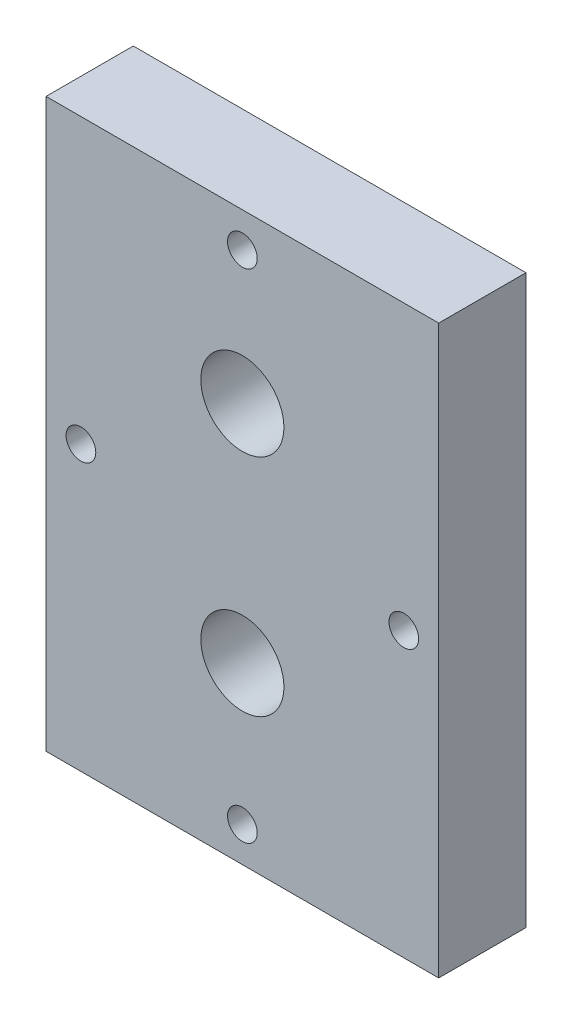
ISO-10303-21;
HEADER;
FILE_DESCRIPTION(('STEP AP214'),'2;1');
FILE_NAME('part.step','',(''),(''),'','','');
FILE_SCHEMA(('AUTOMOTIVE_DESIGN { 1 0 10303 214 1 1 1 1 }'));
ENDSEC;
DATA;
#1=APPLICATION_CONTEXT('core data for automotive mechanical design processes');
#2=APPLICATION_PROTOCOL_DEFINITION('international standard','automotive_design',2000,#1);
#3=PRODUCT_CONTEXT('',#1,'mechanical');
#4=PRODUCT('Part','Part','',(#3));
#5=PRODUCT_RELATED_PRODUCT_CATEGORY('part','',(#4));
#6=PRODUCT_DEFINITION_FORMATION('','',#4);
#7=PRODUCT_DEFINITION_CONTEXT('part definition',#1,'design');
#8=PRODUCT_DEFINITION('design','',#6,#7);
#9=PRODUCT_DEFINITION_SHAPE('','',#8);
#10=(LENGTH_UNIT() NAMED_UNIT(*) SI_UNIT(.MILLI.,.METRE.));
#11=(NAMED_UNIT(*) PLANE_ANGLE_UNIT() SI_UNIT($,.RADIAN.));
#12=(NAMED_UNIT(*) SI_UNIT($,.STERADIAN.) SOLID_ANGLE_UNIT());
#13=UNCERTAINTY_MEASURE_WITH_UNIT(LENGTH_MEASURE(1.E-05),#10,'distance_accuracy_value','');
#14=(GEOMETRIC_REPRESENTATION_CONTEXT(3) GLOBAL_UNCERTAINTY_ASSIGNED_CONTEXT((#13)) GLOBAL_UNIT_ASSIGNED_CONTEXT((#10,
#11,#12)) REPRESENTATION_CONTEXT('',''));
#15=CARTESIAN_POINT('',(0.,0.,0.));
#16=DIRECTION('',(0.,0.,1.));
#17=DIRECTION('',(1.,0.,0.));
#18=AXIS2_PLACEMENT_3D('',#15,#16,#17);
#19=CARTESIAN_POINT('',(-0.782851211177864,123.232367512817,-10.0000000000005));
#20=DIRECTION('',(0.,0.,-1.));
#21=DIRECTION('',(-1.,0.,0.));
#22=AXIS2_PLACEMENT_3D('',#19,#20,#21);
#23=CYLINDRICAL_SURFACE('',#22,1.69999999999999);
#24=CARTESIAN_POINT('',(-0.782851211177864,123.232367512817,0.));
#25=DIRECTION('',(0.,0.,1.));
#26=DIRECTION('',(1.,0.,0.));
#27=AXIS2_PLACEMENT_3D('',#24,#25,#26);
#28=CIRCLE('',#27,1.69999999999999);
#29=CARTESIAN_POINT('',(0.917148788822128,123.232367512817,0.));
#30=VERTEX_POINT('',#29);
#31=EDGE_CURVE('E159',#30,#30,#28,.T.);
#32=ORIENTED_EDGE('',*,*,#31,.T.);
#33=EDGE_LOOP('',(#32));
#34=FACE_BOUND('',#33,.T.);
#35=CARTESIAN_POINT('',(-0.782851211177864,123.232367512817,-7.55));
#36=DIRECTION('',(0.,0.,-1.));
#37=DIRECTION('',(-1.,0.,0.));
#38=AXIS2_PLACEMENT_3D('',#35,#36,#37);
#39=CIRCLE('',#38,1.69999999999999);
#40=CARTESIAN_POINT('',(-2.48285121117786,123.232367512817,-7.55));
#41=VERTEX_POINT('',#40);
#42=EDGE_CURVE('E34',#41,#41,#39,.F.);
#43=ORIENTED_EDGE('',*,*,#42,.F.);
#44=EDGE_LOOP('',(#43));
#45=FACE_BOUND('',#44,.T.);
#46=ADVANCED_FACE('F30',(#34,#45),#23,.F.);
#47=CARTESIAN_POINT('',(-41.7828512111779,90.7323675128174,-10.));
#48=DIRECTION('',(0.,0.,1.));
#49=DIRECTION('',(1.,0.,0.));
#50=AXIS2_PLACEMENT_3D('',#47,#48,#49);
#51=PLANE('',#50);
#52=CARTESIAN_POINT('',(-0.782851211177864,123.232367512817,-10.));
#53=DIRECTION('',(0.,0.,-1.));
#54=DIRECTION('',(-1.,0.,0.));
#55=AXIS2_PLACEMENT_3D('',#52,#53,#54);
#56=CIRCLE('',#55,3.75);
#57=CARTESIAN_POINT('',(-4.53285121117786,123.232367512817,-10.));
#58=VERTEX_POINT('',#57);
#59=EDGE_CURVE('E192',#58,#58,#56,.T.);
#60=ORIENTED_EDGE('',*,*,#59,.F.);
#61=EDGE_LOOP('',(#60));
#62=FACE_BOUND('',#61,.T.);
#63=CARTESIAN_POINT('',(-19.2828512111779,151.732367512817,-10.0000000000005));
#64=DIRECTION('',(0.,0.,-1.));
#65=DIRECTION('',(-1.,0.,0.));
#66=AXIS2_PLACEMENT_3D('',#63,#64,#65);
#67=CIRCLE('',#66,1.69999999999999);
#68=CARTESIAN_POINT('',(-20.9828512111778,151.732367512817,-10.0000000000005));
#69=VERTEX_POINT('',#68);
#70=EDGE_CURVE('E185',#69,#69,#67,.T.);
#71=ORIENTED_EDGE('',*,*,#70,.F.);
#72=EDGE_LOOP('',(#71));
#73=FACE_BOUND('',#72,.T.);
#74=CARTESIAN_POINT('',(-37.7828512111779,123.232367512817,-10.0000000000005));
#75=DIRECTION('',(0.,0.,-1.));
#76=DIRECTION('',(-1.,0.,0.));
#77=AXIS2_PLACEMENT_3D('',#74,#75,#76);
#78=CIRCLE('',#77,1.69999999999999);
#79=CARTESIAN_POINT('',(-39.4828512111779,123.232367512817,-10.0000000000005));
#80=VERTEX_POINT('',#79);
#81=EDGE_CURVE('E180',#80,#80,#78,.T.);
#82=ORIENTED_EDGE('',*,*,#81,.F.);
#83=EDGE_LOOP('',(#82));
#84=FACE_BOUND('',#83,.T.);
#85=CARTESIAN_POINT('',(-19.2828512111779,110.732367512817,-10.));
#86=DIRECTION('',(0.,0.,1.));
#87=DIRECTION('',(1.,0.,0.));
#88=AXIS2_PLACEMENT_3D('',#85,#86,#87);
#89=CIRCLE('',#88,4.7625);
#90=CARTESIAN_POINT('',(-14.5203512111779,110.732367512817,-10.));
#91=VERTEX_POINT('',#90);
#92=EDGE_CURVE('E172',#91,#91,#89,.T.);
#93=ORIENTED_EDGE('',*,*,#92,.T.);
#94=EDGE_LOOP('',(#93));
#95=FACE_BOUND('',#94,.T.);
#96=CARTESIAN_POINT('',(-19.2828512111779,136.502367512817,-10.));
#97=DIRECTION('',(0.,0.,1.));
#98=DIRECTION('',(1.,0.,0.));
#99=AXIS2_PLACEMENT_3D('',#96,#97,#98);
#100=CIRCLE('',#99,4.7625);
#101=CARTESIAN_POINT('',(-14.5203512111779,136.502367512817,-10.));
#102=VERTEX_POINT('',#101);
#103=EDGE_CURVE('E103',#102,#102,#100,.T.);
#104=ORIENTED_EDGE('',*,*,#103,.T.);
#105=EDGE_LOOP('',(#104));
#106=FACE_BOUND('',#105,.T.);
#107=DIRECTION('',(0.,-1.,0.));
#108=VECTOR('',#107,1.);
#109=CARTESIAN_POINT('',(-41.7828512111779,155.732367512817,-10.));
#110=LINE('',#109,#108);
#111=CARTESIAN_POINT('',(-41.7828512111779,155.732367512817,-10.));
#112=VERTEX_POINT('',#111);
#113=CARTESIAN_POINT('',(-41.7828512111779,90.7323675128174,-10.));
#114=VERTEX_POINT('',#113);
#115=EDGE_CURVE('E92',#112,#114,#110,.T.);
#116=ORIENTED_EDGE('',*,*,#115,.F.);
#117=DIRECTION('',(-1.,0.,0.));
#118=VECTOR('',#117,1.);
#119=CARTESIAN_POINT('',(-41.7828512111779,155.732367512817,-10.));
#120=LINE('',#119,#118);
#121=CARTESIAN_POINT('',(3.21714878882212,155.732367512817,-10.));
#122=VERTEX_POINT('',#121);
#123=EDGE_CURVE('E89',#122,#112,#120,.T.);
#124=ORIENTED_EDGE('',*,*,#123,.F.);
#125=DIRECTION('',(0.,1.,0.));
#126=VECTOR('',#125,1.);
#127=CARTESIAN_POINT('',(3.21714878882212,155.732367512817,-10.));
#128=LINE('',#127,#126);
#129=CARTESIAN_POINT('',(3.21714878882213,90.7323675128174,-10.));
#130=VERTEX_POINT('',#129);
#131=EDGE_CURVE('E80',#130,#122,#128,.T.);
#132=ORIENTED_EDGE('',*,*,#131,.F.);
#133=DIRECTION('',(1.,0.,0.));
#134=VECTOR('',#133,1.);
#135=CARTESIAN_POINT('',(-41.7828512111779,90.7323675128174,-10.));
#136=LINE('',#135,#134);
#137=EDGE_CURVE('E88',#114,#130,#136,.T.);
#138=ORIENTED_EDGE('',*,*,#137,.F.);
#139=EDGE_LOOP('',(#116,#124,#132,#138));
#140=FACE_BOUND('',#139,.T.);
#141=CARTESIAN_POINT('',(-19.2828512111779,94.7323675128174,-10.0000000000005));
#142=DIRECTION('',(0.,0.,-1.));
#143=DIRECTION('',(-1.,0.,0.));
#144=AXIS2_PLACEMENT_3D('',#141,#142,#143);
#145=CIRCLE('',#144,1.69999999999999);
#146=CARTESIAN_POINT('',(-20.9828512111779,94.7323675128174,-10.0000000000005));
#147=VERTEX_POINT('',#146);
#148=EDGE_CURVE('E189',#147,#147,#145,.T.);
#149=ORIENTED_EDGE('',*,*,#148,.F.);
#150=EDGE_LOOP('',(#149));
#151=FACE_BOUND('',#150,.T.);
#152=ADVANCED_FACE('F86',(#62,#73,#84,#95,#106,#140,#151),#51,.F.);
#153=CARTESIAN_POINT('',(-41.7828512111779,155.732367512817,-10.));
#154=DIRECTION('',(-1.,0.,0.));
#155=DIRECTION('',(0.,-1.,0.));
#156=AXIS2_PLACEMENT_3D('',#153,#154,#155);
#157=PLANE('',#156);
#158=DIRECTION('',(0.,-1.,0.));
#159=VECTOR('',#158,1.);
#160=CARTESIAN_POINT('',(-41.7828512111779,155.732367512817,0.));
#161=LINE('',#160,#159);
#162=CARTESIAN_POINT('',(-41.7828512111779,155.732367512817,0.));
#163=VERTEX_POINT('',#162);
#164=CARTESIAN_POINT('',(-41.7828512111779,90.7323675128174,0.));
#165=VERTEX_POINT('',#164);
#166=EDGE_CURVE('E99',#163,#165,#161,.T.);
#167=ORIENTED_EDGE('',*,*,#166,.F.);
#168=DIRECTION('',(0.,0.,1.));
#169=VECTOR('',#168,1.);
#170=CARTESIAN_POINT('',(-41.7828512111779,155.732367512817,-10.));
#171=LINE('',#170,#169);
#172=EDGE_CURVE('E11',#112,#163,#171,.T.);
#173=ORIENTED_EDGE('',*,*,#172,.F.);
#174=ORIENTED_EDGE('',*,*,#115,.T.);
#175=DIRECTION('',(0.,0.,1.));
#176=VECTOR('',#175,1.);
#177=CARTESIAN_POINT('',(-41.7828512111779,90.7323675128174,-10.));
#178=LINE('',#177,#176);
#179=EDGE_CURVE('E74',#114,#165,#178,.T.);
#180=ORIENTED_EDGE('',*,*,#179,.T.);
#181=EDGE_LOOP('',(#167,#173,#174,#180));
#182=FACE_BOUND('',#181,.T.);
#183=ADVANCED_FACE('F32',(#182),#157,.T.);
#184=CARTESIAN_POINT('',(-41.7828512111779,155.732367512817,-10.));
#185=DIRECTION('',(0.,1.,0.));
#186=DIRECTION('',(0.,0.,1.));
#187=AXIS2_PLACEMENT_3D('',#184,#185,#186);
#188=PLANE('',#187);
#189=DIRECTION('',(-1.,0.,0.));
#190=VECTOR('',#189,1.);
#191=CARTESIAN_POINT('',(-41.7828512111779,155.732367512817,0.));
#192=LINE('',#191,#190);
#193=CARTESIAN_POINT('',(3.21714878882212,155.732367512817,0.));
#194=VERTEX_POINT('',#193);
#195=EDGE_CURVE('E94',#194,#163,#192,.T.);
#196=ORIENTED_EDGE('',*,*,#195,.F.);
#197=DIRECTION('',(0.,0.,1.));
#198=VECTOR('',#197,1.);
#199=CARTESIAN_POINT('',(3.21714878882212,155.732367512817,-10.));
#200=LINE('',#199,#198);
#201=EDGE_CURVE('E40',#122,#194,#200,.T.);
#202=ORIENTED_EDGE('',*,*,#201,.F.);
#203=ORIENTED_EDGE('',*,*,#123,.T.);
#204=ORIENTED_EDGE('',*,*,#172,.T.);
#205=EDGE_LOOP('',(#196,#202,#203,#204));
#206=FACE_BOUND('',#205,.T.);
#207=ADVANCED_FACE('F110',(#206),#188,.T.);
#208=CARTESIAN_POINT('',(3.21714878882212,155.732367512817,-10.));
#209=DIRECTION('',(1.,0.,0.));
#210=DIRECTION('',(0.,1.,0.));
#211=AXIS2_PLACEMENT_3D('',#208,#209,#210);
#212=PLANE('',#211);
#213=DIRECTION('',(0.,1.,0.));
#214=VECTOR('',#213,1.);
#215=CARTESIAN_POINT('',(3.21714878882212,155.732367512817,0.));
#216=LINE('',#215,#214);
#217=CARTESIAN_POINT('',(3.21714878882213,90.7323675128174,0.));
#218=VERTEX_POINT('',#217);
#219=EDGE_CURVE('E82',#218,#194,#216,.T.);
#220=ORIENTED_EDGE('',*,*,#219,.F.);
#221=DIRECTION('',(0.,0.,1.));
#222=VECTOR('',#221,1.);
#223=CARTESIAN_POINT('',(3.21714878882213,90.7323675128174,-10.));
#224=LINE('',#223,#222);
#225=EDGE_CURVE('E77',#130,#218,#224,.T.);
#226=ORIENTED_EDGE('',*,*,#225,.F.);
#227=ORIENTED_EDGE('',*,*,#131,.T.);
#228=ORIENTED_EDGE('',*,*,#201,.T.);
#229=EDGE_LOOP('',(#220,#226,#227,#228));
#230=FACE_BOUND('',#229,.T.);
#231=ADVANCED_FACE('F79',(#230),#212,.T.);
#232=CARTESIAN_POINT('',(-41.7828512111779,90.7323675128174,-10.));
#233=DIRECTION('',(0.,-1.,0.));
#234=DIRECTION('',(0.,0.,-1.));
#235=AXIS2_PLACEMENT_3D('',#232,#233,#234);
#236=PLANE('',#235);
#237=DIRECTION('',(1.,0.,0.));
#238=VECTOR('',#237,1.);
#239=CARTESIAN_POINT('',(-41.7828512111779,90.7323675128174,0.));
#240=LINE('',#239,#238);
#241=EDGE_CURVE('E102',#165,#218,#240,.T.);
#242=ORIENTED_EDGE('',*,*,#241,.F.);
#243=ORIENTED_EDGE('',*,*,#179,.F.);
#244=ORIENTED_EDGE('',*,*,#137,.T.);
#245=ORIENTED_EDGE('',*,*,#225,.T.);
#246=EDGE_LOOP('',(#242,#243,#244,#245));
#247=FACE_BOUND('',#246,.T.);
#248=ADVANCED_FACE('F91',(#247),#236,.T.);
#249=CARTESIAN_POINT('',(-41.7828512111779,90.7323675128174,0.));
#250=DIRECTION('',(0.,0.,1.));
#251=DIRECTION('',(1.,0.,0.));
#252=AXIS2_PLACEMENT_3D('',#249,#250,#251);
#253=PLANE('',#252);
#254=CARTESIAN_POINT('',(-19.2828512111779,94.7323675128174,0.));
#255=DIRECTION('',(0.,0.,1.));
#256=DIRECTION('',(1.,0.,0.));
#257=AXIS2_PLACEMENT_3D('',#254,#255,#256);
#258=CIRCLE('',#257,1.69999999999999);
#259=CARTESIAN_POINT('',(-17.5828512111779,94.7323675128174,0.));
#260=VERTEX_POINT('',#259);
#261=EDGE_CURVE('E152',#260,#260,#258,.T.);
#262=ORIENTED_EDGE('',*,*,#261,.F.);
#263=EDGE_LOOP('',(#262));
#264=FACE_BOUND('',#263,.T.);
#265=CARTESIAN_POINT('',(-19.2828512111779,151.732367512817,0.));
#266=DIRECTION('',(0.,0.,1.));
#267=DIRECTION('',(1.,0.,0.));
#268=AXIS2_PLACEMENT_3D('',#265,#266,#267);
#269=CIRCLE('',#268,1.69999999999999);
#270=CARTESIAN_POINT('',(-17.5828512111779,151.732367512817,0.));
#271=VERTEX_POINT('',#270);
#272=EDGE_CURVE('E156',#271,#271,#269,.T.);
#273=ORIENTED_EDGE('',*,*,#272,.F.);
#274=EDGE_LOOP('',(#273));
#275=FACE_BOUND('',#274,.T.);
#276=ORIENTED_EDGE('',*,*,#31,.F.);
#277=EDGE_LOOP('',(#276));
#278=FACE_BOUND('',#277,.T.);
#279=CARTESIAN_POINT('',(-37.7828512111779,123.232367512817,0.));
#280=DIRECTION('',(0.,0.,1.));
#281=DIRECTION('',(1.,0.,0.));
#282=AXIS2_PLACEMENT_3D('',#279,#280,#281);
#283=CIRCLE('',#282,1.69999999999999);
#284=CARTESIAN_POINT('',(-36.0828512111779,123.232367512817,0.));
#285=VERTEX_POINT('',#284);
#286=EDGE_CURVE('E163',#285,#285,#283,.T.);
#287=ORIENTED_EDGE('',*,*,#286,.F.);
#288=EDGE_LOOP('',(#287));
#289=FACE_BOUND('',#288,.T.);
#290=CARTESIAN_POINT('',(-19.2828512111779,110.732367512817,0.));
#291=DIRECTION('',(0.,0.,1.));
#292=DIRECTION('',(1.,0.,0.));
#293=AXIS2_PLACEMENT_3D('',#290,#291,#292);
#294=CIRCLE('',#293,4.7625);
#295=CARTESIAN_POINT('',(-14.5203512111779,110.732367512817,0.));
#296=VERTEX_POINT('',#295);
#297=EDGE_CURVE('E167',#296,#296,#294,.T.);
#298=ORIENTED_EDGE('',*,*,#297,.F.);
#299=EDGE_LOOP('',(#298));
#300=FACE_BOUND('',#299,.T.);
#301=CARTESIAN_POINT('',(-19.2828512111779,136.502367512817,0.));
#302=DIRECTION('',(0.,0.,1.));
#303=DIRECTION('',(1.,0.,0.));
#304=AXIS2_PLACEMENT_3D('',#301,#302,#303);
#305=CIRCLE('',#304,4.7625);
#306=CARTESIAN_POINT('',(-14.5203512111779,136.502367512817,0.));
#307=VERTEX_POINT('',#306);
#308=EDGE_CURVE('E170',#307,#307,#305,.T.);
#309=ORIENTED_EDGE('',*,*,#308,.F.);
#310=EDGE_LOOP('',(#309));
#311=FACE_BOUND('',#310,.T.);
#312=ORIENTED_EDGE('',*,*,#166,.T.);
#313=ORIENTED_EDGE('',*,*,#241,.T.);
#314=ORIENTED_EDGE('',*,*,#219,.T.);
#315=ORIENTED_EDGE('',*,*,#195,.T.);
#316=EDGE_LOOP('',(#312,#313,#314,#315));
#317=FACE_BOUND('',#316,.T.);
#318=ADVANCED_FACE('F109',(#264,#275,#278,#289,#300,#311,#317),#253,.T.);
#319=CARTESIAN_POINT('',(-19.2828512111779,136.502367512817,-10.));
#320=DIRECTION('',(0.,0.,1.));
#321=DIRECTION('',(1.,0.,0.));
#322=AXIS2_PLACEMENT_3D('',#319,#320,#321);
#323=CYLINDRICAL_SURFACE('',#322,4.7625);
#324=ORIENTED_EDGE('',*,*,#103,.F.);
#325=EDGE_LOOP('',(#324));
#326=FACE_BOUND('',#325,.T.);
#327=ORIENTED_EDGE('',*,*,#308,.T.);
#328=EDGE_LOOP('',(#327));
#329=FACE_BOUND('',#328,.T.);
#330=ADVANCED_FACE('F140',(#326,#329),#323,.F.);
#331=CARTESIAN_POINT('',(-19.2828512111779,110.732367512817,-10.));
#332=DIRECTION('',(0.,0.,1.));
#333=DIRECTION('',(1.,0.,0.));
#334=AXIS2_PLACEMENT_3D('',#331,#332,#333);
#335=CYLINDRICAL_SURFACE('',#334,4.7625);
#336=ORIENTED_EDGE('',*,*,#92,.F.);
#337=EDGE_LOOP('',(#336));
#338=FACE_BOUND('',#337,.T.);
#339=ORIENTED_EDGE('',*,*,#297,.T.);
#340=EDGE_LOOP('',(#339));
#341=FACE_BOUND('',#340,.T.);
#342=ADVANCED_FACE('F136',(#338,#341),#335,.F.);
#343=CARTESIAN_POINT('',(-37.7828512111779,123.232367512817,-10.0000000000005));
#344=DIRECTION('',(0.,0.,-1.));
#345=DIRECTION('',(-1.,0.,0.));
#346=AXIS2_PLACEMENT_3D('',#343,#344,#345);
#347=CYLINDRICAL_SURFACE('',#346,1.69999999999999);
#348=ORIENTED_EDGE('',*,*,#81,.T.);
#349=EDGE_LOOP('',(#348));
#350=FACE_BOUND('',#349,.T.);
#351=ORIENTED_EDGE('',*,*,#286,.T.);
#352=EDGE_LOOP('',(#351));
#353=FACE_BOUND('',#352,.T.);
#354=ADVANCED_FACE('F133',(#350,#353),#347,.F.);
#355=CARTESIAN_POINT('',(-19.2828512111779,151.732367512817,-10.0000000000005));
#356=DIRECTION('',(0.,0.,-1.));
#357=DIRECTION('',(-1.,0.,0.));
#358=AXIS2_PLACEMENT_3D('',#355,#356,#357);
#359=CYLINDRICAL_SURFACE('',#358,1.69999999999999);
#360=ORIENTED_EDGE('',*,*,#70,.T.);
#361=EDGE_LOOP('',(#360));
#362=FACE_BOUND('',#361,.T.);
#363=ORIENTED_EDGE('',*,*,#272,.T.);
#364=EDGE_LOOP('',(#363));
#365=FACE_BOUND('',#364,.T.);
#366=ADVANCED_FACE('F131',(#362,#365),#359,.F.);
#367=CARTESIAN_POINT('',(-19.2828512111779,94.7323675128174,-10.0000000000005));
#368=DIRECTION('',(0.,0.,-1.));
#369=DIRECTION('',(-1.,0.,0.));
#370=AXIS2_PLACEMENT_3D('',#367,#368,#369);
#371=CYLINDRICAL_SURFACE('',#370,1.69999999999999);
#372=ORIENTED_EDGE('',*,*,#148,.T.);
#373=EDGE_LOOP('',(#372));
#374=FACE_BOUND('',#373,.T.);
#375=ORIENTED_EDGE('',*,*,#261,.T.);
#376=EDGE_LOOP('',(#375));
#377=FACE_BOUND('',#376,.T.);
#378=ADVANCED_FACE('F205',(#374,#377),#371,.F.);
#379=CARTESIAN_POINT('',(-0.782851211177864,123.232367512817,-7.55));
#380=DIRECTION('',(0.,0.,-1.));
#381=DIRECTION('',(-1.,0.,0.));
#382=AXIS2_PLACEMENT_3D('',#379,#380,#381);
#383=PLANE('',#382);
#384=CARTESIAN_POINT('',(-0.782851211177864,123.232367512817,-7.55));
#385=DIRECTION('',(0.,0.,-1.));
#386=DIRECTION('',(-1.,0.,0.));
#387=AXIS2_PLACEMENT_3D('',#384,#385,#386);
#388=CIRCLE('',#387,3.75);
#389=CARTESIAN_POINT('',(-4.53285121117786,123.232367512817,-7.55));
#390=VERTEX_POINT('',#389);
#391=EDGE_CURVE('E195',#390,#390,#388,.T.);
#392=ORIENTED_EDGE('',*,*,#391,.T.);
#393=EDGE_LOOP('',(#392));
#394=FACE_BOUND('',#393,.T.);
#395=ORIENTED_EDGE('',*,*,#42,.T.);
#396=EDGE_LOOP('',(#395));
#397=FACE_BOUND('',#396,.T.);
#398=ADVANCED_FACE('F202',(#394,#397),#383,.T.);
#399=CARTESIAN_POINT('',(-0.782851211177864,123.232367512817,-7.55));
#400=DIRECTION('',(0.,0.,-1.));
#401=DIRECTION('',(-1.,0.,0.));
#402=AXIS2_PLACEMENT_3D('',#399,#400,#401);
#403=CYLINDRICAL_SURFACE('',#402,3.75);
#404=ORIENTED_EDGE('',*,*,#391,.F.);
#405=EDGE_LOOP('',(#404));
#406=FACE_BOUND('',#405,.T.);
#407=ORIENTED_EDGE('',*,*,#59,.T.);
#408=EDGE_LOOP('',(#407));
#409=FACE_BOUND('',#408,.T.);
#410=ADVANCED_FACE('F204',(#406,#409),#403,.F.);
#411=CLOSED_SHELL('',(#46,#152,#183,#207,#231,#248,#318,#330,#342,#354,#366,#378,#398,#410));
#412=MANIFOLD_SOLID_BREP('B2',#411);
#413=ADVANCED_BREP_SHAPE_REPRESENTATION('',(#18,#412),#14);
#414=SHAPE_DEFINITION_REPRESENTATION(#9,#413);
ENDSEC;
END-ISO-10303-21;
